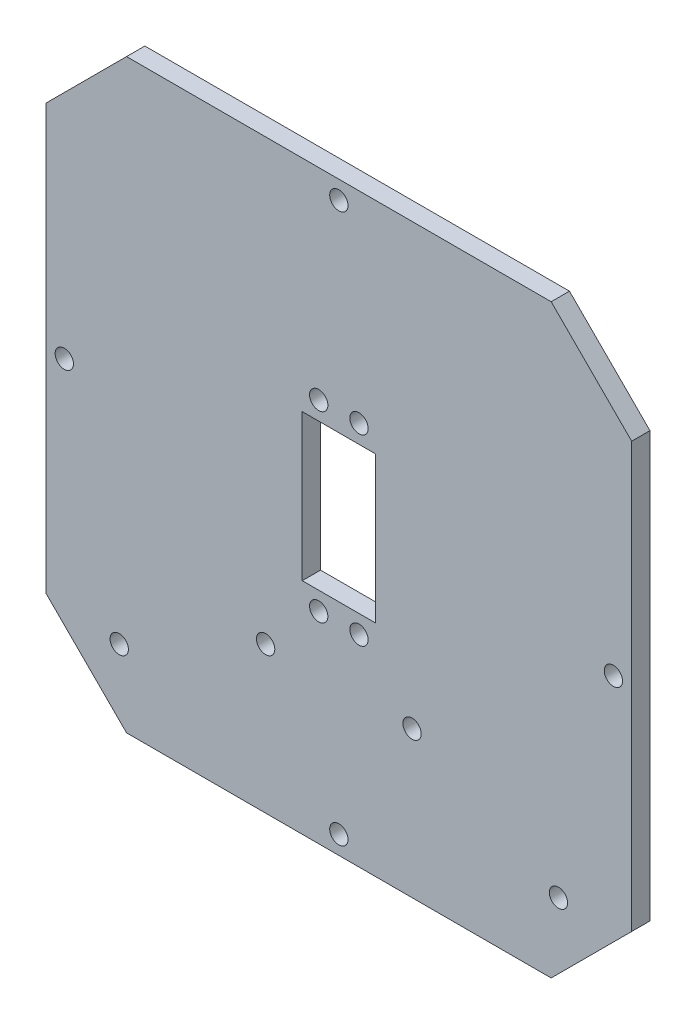
ISO-10303-21;
HEADER;
FILE_DESCRIPTION(('STEP AP214'),'2;1');
FILE_NAME('part.step','',(''),(''),'','','');
FILE_SCHEMA(('AUTOMOTIVE_DESIGN { 1 0 10303 214 1 1 1 1 }'));
ENDSEC;
DATA;
#1=APPLICATION_CONTEXT('core data for automotive mechanical design processes');
#2=APPLICATION_PROTOCOL_DEFINITION('international standard','automotive_design',2000,#1);
#3=PRODUCT_CONTEXT('',#1,'mechanical');
#4=PRODUCT('Part','Part','',(#3));
#5=PRODUCT_RELATED_PRODUCT_CATEGORY('part','',(#4));
#6=PRODUCT_DEFINITION_FORMATION('','',#4);
#7=PRODUCT_DEFINITION_CONTEXT('part definition',#1,'design');
#8=PRODUCT_DEFINITION('design','',#6,#7);
#9=PRODUCT_DEFINITION_SHAPE('','',#8);
#10=(LENGTH_UNIT() NAMED_UNIT(*) SI_UNIT(.MILLI.,.METRE.));
#11=(NAMED_UNIT(*) PLANE_ANGLE_UNIT() SI_UNIT($,.RADIAN.));
#12=(NAMED_UNIT(*) SI_UNIT($,.STERADIAN.) SOLID_ANGLE_UNIT());
#13=UNCERTAINTY_MEASURE_WITH_UNIT(LENGTH_MEASURE(1.E-05),#10,'distance_accuracy_value','');
#14=(GEOMETRIC_REPRESENTATION_CONTEXT(3) GLOBAL_UNCERTAINTY_ASSIGNED_CONTEXT((#13)) GLOBAL_UNIT_ASSIGNED_CONTEXT((#10,
#11,#12)) REPRESENTATION_CONTEXT('',''));
#15=CARTESIAN_POINT('',(0.,0.,0.));
#16=DIRECTION('',(0.,0.,1.));
#17=DIRECTION('',(1.,0.,0.));
#18=AXIS2_PLACEMENT_3D('',#15,#16,#17);
#19=CARTESIAN_POINT('',(-28.3501175972928,34.1567681895093,5.));
#20=DIRECTION('',(1.,0.,0.));
#21=DIRECTION('',(0.,1.,0.));
#22=AXIS2_PLACEMENT_3D('',#19,#20,#21);
#23=PLANE('',#22);
#24=DIRECTION('',(0.,-1.,0.));
#25=VECTOR('',#24,1.);
#26=CARTESIAN_POINT('',(-28.3501175972928,34.1567681895093,0.));
#27=LINE('',#26,#25);
#28=CARTESIAN_POINT('',(-28.3501175972927,12.1567681895093,0.));
#29=VERTEX_POINT('',#28);
#30=CARTESIAN_POINT('',(-28.3501175972927,-103.843231810491,0.));
#31=VERTEX_POINT('',#30);
#32=EDGE_CURVE('E161',#29,#31,#27,.T.);
#33=ORIENTED_EDGE('',*,*,#32,.T.);
#34=DIRECTION('',(0.,0.,1.));
#35=VECTOR('',#34,1.);
#36=CARTESIAN_POINT('',(-28.3501175972927,-103.843231810491,5.));
#37=LINE('',#36,#35);
#38=CARTESIAN_POINT('',(-28.3501175972927,-103.843231810491,5.));
#39=VERTEX_POINT('',#38);
#40=EDGE_CURVE('E204',#31,#39,#37,.T.);
#41=ORIENTED_EDGE('',*,*,#40,.T.);
#42=DIRECTION('',(0.,-1.,0.));
#43=VECTOR('',#42,1.);
#44=CARTESIAN_POINT('',(-28.3501175972928,34.1567681895093,5.));
#45=LINE('',#44,#43);
#46=CARTESIAN_POINT('',(-28.3501175972927,12.1567681895093,5.));
#47=VERTEX_POINT('',#46);
#48=EDGE_CURVE('E165',#47,#39,#45,.T.);
#49=ORIENTED_EDGE('',*,*,#48,.F.);
#50=DIRECTION('',(0.,0.,-1.));
#51=VECTOR('',#50,1.);
#52=CARTESIAN_POINT('',(-28.3501175972927,12.1567681895093,5.));
#53=LINE('',#52,#51);
#54=EDGE_CURVE('E201',#47,#29,#53,.T.);
#55=ORIENTED_EDGE('',*,*,#54,.T.);
#56=EDGE_LOOP('',(#33,#41,#49,#55));
#57=FACE_BOUND('',#56,.T.);
#58=ADVANCED_FACE('F33',(#57),#23,.F.);
#59=CARTESIAN_POINT('',(-28.3501175972927,-125.843231810491,5.));
#60=DIRECTION('',(0.,1.,0.));
#61=DIRECTION('',(0.,0.,1.));
#62=AXIS2_PLACEMENT_3D('',#59,#60,#61);
#63=PLANE('',#62);
#64=DIRECTION('',(1.,0.,0.));
#65=VECTOR('',#64,1.);
#66=CARTESIAN_POINT('',(-28.3501175972927,-125.843231810491,5.));
#67=LINE('',#66,#65);
#68=CARTESIAN_POINT('',(-6.35011759729272,-125.843231810491,5.));
#69=VERTEX_POINT('',#68);
#70=CARTESIAN_POINT('',(109.649882402707,-125.843231810491,5.));
#71=VERTEX_POINT('',#70);
#72=EDGE_CURVE('E168',#69,#71,#67,.T.);
#73=ORIENTED_EDGE('',*,*,#72,.F.);
#74=DIRECTION('',(0.,0.,-1.));
#75=VECTOR('',#74,1.);
#76=CARTESIAN_POINT('',(-6.35011759729274,-125.843231810491,5.));
#77=LINE('',#76,#75);
#78=CARTESIAN_POINT('',(-6.35011759729274,-125.843231810491,0.));
#79=VERTEX_POINT('',#78);
#80=EDGE_CURVE('E190',#69,#79,#77,.T.);
#81=ORIENTED_EDGE('',*,*,#80,.T.);
#82=DIRECTION('',(1.,0.,0.));
#83=VECTOR('',#82,1.);
#84=CARTESIAN_POINT('',(-28.3501175972927,-125.843231810491,0.));
#85=LINE('',#84,#83);
#86=CARTESIAN_POINT('',(109.649882402707,-125.843231810491,0.));
#87=VERTEX_POINT('',#86);
#88=EDGE_CURVE('E181',#79,#87,#85,.T.);
#89=ORIENTED_EDGE('',*,*,#88,.T.);
#90=DIRECTION('',(0.,0.,1.));
#91=VECTOR('',#90,1.);
#92=CARTESIAN_POINT('',(109.649882402707,-125.843231810491,5.));
#93=LINE('',#92,#91);
#94=EDGE_CURVE('E178',#87,#71,#93,.T.);
#95=ORIENTED_EDGE('',*,*,#94,.T.);
#96=EDGE_LOOP('',(#73,#81,#89,#95));
#97=FACE_BOUND('',#96,.T.);
#98=ADVANCED_FACE('F302',(#97),#63,.F.);
#99=CARTESIAN_POINT('',(131.649882402707,34.1567681895093,5.));
#100=DIRECTION('',(-1.,0.,0.));
#101=DIRECTION('',(0.,-1.,0.));
#102=AXIS2_PLACEMENT_3D('',#99,#100,#101);
#103=PLANE('',#102);
#104=DIRECTION('',(0.,1.,0.));
#105=VECTOR('',#104,1.);
#106=CARTESIAN_POINT('',(131.649882402707,34.1567681895093,5.));
#107=LINE('',#106,#105);
#108=CARTESIAN_POINT('',(131.649882402707,-103.843231810491,5.));
#109=VERTEX_POINT('',#108);
#110=CARTESIAN_POINT('',(131.649882402707,12.1567681895092,5.));
#111=VERTEX_POINT('',#110);
#112=EDGE_CURVE('E172',#109,#111,#107,.T.);
#113=ORIENTED_EDGE('',*,*,#112,.F.);
#114=DIRECTION('',(0.,0.,-1.));
#115=VECTOR('',#114,1.);
#116=CARTESIAN_POINT('',(131.649882402707,-103.843231810491,5.));
#117=LINE('',#116,#115);
#118=CARTESIAN_POINT('',(131.649882402707,-103.843231810491,0.));
#119=VERTEX_POINT('',#118);
#120=EDGE_CURVE('E216',#109,#119,#117,.T.);
#121=ORIENTED_EDGE('',*,*,#120,.T.);
#122=DIRECTION('',(0.,1.,0.));
#123=VECTOR('',#122,1.);
#124=CARTESIAN_POINT('',(131.649882402707,34.1567681895093,0.));
#125=LINE('',#124,#123);
#126=CARTESIAN_POINT('',(131.649882402707,12.1567681895092,0.));
#127=VERTEX_POINT('',#126);
#128=EDGE_CURVE('E184',#119,#127,#125,.T.);
#129=ORIENTED_EDGE('',*,*,#128,.T.);
#130=DIRECTION('',(0.,0.,1.));
#131=VECTOR('',#130,1.);
#132=CARTESIAN_POINT('',(131.649882402707,12.1567681895092,5.));
#133=LINE('',#132,#131);
#134=EDGE_CURVE('E214',#127,#111,#133,.T.);
#135=ORIENTED_EDGE('',*,*,#134,.T.);
#136=EDGE_LOOP('',(#113,#121,#129,#135));
#137=FACE_BOUND('',#136,.T.);
#138=ADVANCED_FACE('F312',(#137),#103,.F.);
#139=CARTESIAN_POINT('',(-28.3501175972928,34.1567681895093,5.));
#140=DIRECTION('',(0.,-1.,0.));
#141=DIRECTION('',(0.,0.,-1.));
#142=AXIS2_PLACEMENT_3D('',#139,#140,#141);
#143=PLANE('',#142);
#144=DIRECTION('',(-1.,0.,0.));
#145=VECTOR('',#144,1.);
#146=CARTESIAN_POINT('',(-28.3501175972928,34.1567681895093,5.));
#147=LINE('',#146,#145);
#148=CARTESIAN_POINT('',(109.649882402707,34.1567681895093,5.));
#149=VERTEX_POINT('',#148);
#150=CARTESIAN_POINT('',(-6.35011759729264,34.1567681895093,5.));
#151=VERTEX_POINT('',#150);
#152=EDGE_CURVE('E175',#149,#151,#147,.T.);
#153=ORIENTED_EDGE('',*,*,#152,.F.);
#154=DIRECTION('',(0.,0.,-1.));
#155=VECTOR('',#154,1.);
#156=CARTESIAN_POINT('',(109.649882402707,34.1567681895093,5.));
#157=LINE('',#156,#155);
#158=CARTESIAN_POINT('',(109.649882402707,34.1567681895093,0.));
#159=VERTEX_POINT('',#158);
#160=EDGE_CURVE('E11',#149,#159,#157,.T.);
#161=ORIENTED_EDGE('',*,*,#160,.T.);
#162=DIRECTION('',(-1.,0.,0.));
#163=VECTOR('',#162,1.);
#164=CARTESIAN_POINT('',(-28.3501175972928,34.1567681895093,0.));
#165=LINE('',#164,#163);
#166=CARTESIAN_POINT('',(-6.35011759729264,34.1567681895093,0.));
#167=VERTEX_POINT('',#166);
#168=EDGE_CURVE('E169',#159,#167,#165,.T.);
#169=ORIENTED_EDGE('',*,*,#168,.T.);
#170=DIRECTION('',(0.,0.,1.));
#171=VECTOR('',#170,1.);
#172=CARTESIAN_POINT('',(-6.35011759729264,34.1567681895093,5.));
#173=LINE('',#172,#171);
#174=EDGE_CURVE('E42',#167,#151,#173,.T.);
#175=ORIENTED_EDGE('',*,*,#174,.T.);
#176=EDGE_LOOP('',(#153,#161,#169,#175));
#177=FACE_BOUND('',#176,.T.);
#178=ADVANCED_FACE('F285',(#177),#143,.F.);
#179=CARTESIAN_POINT('',(0.,0.,5.));
#180=DIRECTION('',(0.,0.,1.));
#181=DIRECTION('',(1.,0.,0.));
#182=AXIS2_PLACEMENT_3D('',#179,#180,#181);
#183=PLANE('',#182);
#184=CARTESIAN_POINT('',(31.6498824027073,-85.8432318104907,5.));
#185=DIRECTION('',(0.,0.,1.));
#186=DIRECTION('',(1.,0.,0.));
#187=AXIS2_PLACEMENT_3D('',#184,#185,#186);
#188=CIRCLE('',#187,2.5);
#189=CARTESIAN_POINT('',(34.1498824027073,-85.8432318104907,5.));
#190=VERTEX_POINT('',#189);
#191=EDGE_CURVE('E538',#190,#190,#188,.T.);
#192=ORIENTED_EDGE('',*,*,#191,.F.);
#193=EDGE_LOOP('',(#192));
#194=FACE_BOUND('',#193,.T.);
#195=CARTESIAN_POINT('',(71.6498824027073,-85.8432318104907,5.));
#196=DIRECTION('',(0.,0.,1.));
#197=DIRECTION('',(1.,0.,0.));
#198=AXIS2_PLACEMENT_3D('',#195,#196,#197);
#199=CIRCLE('',#198,2.5);
#200=CARTESIAN_POINT('',(74.1498824027073,-85.8432318104907,5.));
#201=VERTEX_POINT('',#200);
#202=EDGE_CURVE('E547',#201,#201,#199,.T.);
#203=ORIENTED_EDGE('',*,*,#202,.F.);
#204=EDGE_LOOP('',(#203));
#205=FACE_BOUND('',#204,.T.);
#206=CARTESIAN_POINT('',(-8.35011759729274,-105.843231810491,5.));
#207=DIRECTION('',(0.,0.,1.));
#208=DIRECTION('',(1.,0.,0.));
#209=AXIS2_PLACEMENT_3D('',#206,#207,#208);
#210=CIRCLE('',#209,2.5);
#211=CARTESIAN_POINT('',(-5.85011759729274,-105.843231810491,5.));
#212=VERTEX_POINT('',#211);
#213=EDGE_CURVE('E248',#212,#212,#210,.T.);
#214=ORIENTED_EDGE('',*,*,#213,.F.);
#215=EDGE_LOOP('',(#214));
#216=FACE_BOUND('',#215,.T.);
#217=CARTESIAN_POINT('',(111.649882402707,-105.843231810491,5.));
#218=DIRECTION('',(0.,0.,1.));
#219=DIRECTION('',(1.,0.,0.));
#220=AXIS2_PLACEMENT_3D('',#217,#218,#219);
#221=CIRCLE('',#220,2.50000000000001);
#222=CARTESIAN_POINT('',(114.149882402707,-105.843231810491,5.));
#223=VERTEX_POINT('',#222);
#224=EDGE_CURVE('E238',#223,#223,#221,.T.);
#225=ORIENTED_EDGE('',*,*,#224,.F.);
#226=EDGE_LOOP('',(#225));
#227=FACE_BOUND('',#226,.T.);
#228=CARTESIAN_POINT('',(126.649882402707,-45.8432318104907,5.));
#229=DIRECTION('',(0.,0.,1.));
#230=DIRECTION('',(1.,0.,0.));
#231=AXIS2_PLACEMENT_3D('',#228,#229,#230);
#232=CIRCLE('',#231,2.5);
#233=CARTESIAN_POINT('',(129.149882402707,-45.8432318104907,5.));
#234=VERTEX_POINT('',#233);
#235=EDGE_CURVE('E235',#234,#234,#232,.T.);
#236=ORIENTED_EDGE('',*,*,#235,.F.);
#237=EDGE_LOOP('',(#236));
#238=FACE_BOUND('',#237,.T.);
#239=CARTESIAN_POINT('',(51.6498824027073,-120.843231810491,5.));
#240=DIRECTION('',(0.,0.,1.));
#241=DIRECTION('',(1.,0.,0.));
#242=AXIS2_PLACEMENT_3D('',#239,#240,#241);
#243=CIRCLE('',#242,2.5);
#244=CARTESIAN_POINT('',(54.1498824027073,-120.843231810491,5.));
#245=VERTEX_POINT('',#244);
#246=EDGE_CURVE('E232',#245,#245,#243,.T.);
#247=ORIENTED_EDGE('',*,*,#246,.F.);
#248=EDGE_LOOP('',(#247));
#249=FACE_BOUND('',#248,.T.);
#250=CARTESIAN_POINT('',(-23.3501175972927,-45.8432318104907,5.));
#251=DIRECTION('',(0.,0.,1.));
#252=DIRECTION('',(1.,0.,0.));
#253=AXIS2_PLACEMENT_3D('',#250,#251,#252);
#254=CIRCLE('',#253,2.5);
#255=CARTESIAN_POINT('',(-20.8501175972927,-45.8432318104907,5.));
#256=VERTEX_POINT('',#255);
#257=EDGE_CURVE('E228',#256,#256,#254,.T.);
#258=ORIENTED_EDGE('',*,*,#257,.F.);
#259=EDGE_LOOP('',(#258));
#260=FACE_BOUND('',#259,.T.);
#261=CARTESIAN_POINT('',(51.6498824027073,29.1567681895093,5.));
#262=DIRECTION('',(0.,0.,1.));
#263=DIRECTION('',(1.,0.,0.));
#264=AXIS2_PLACEMENT_3D('',#261,#262,#263);
#265=CIRCLE('',#264,2.5);
#266=CARTESIAN_POINT('',(54.1498824027073,29.1567681895093,5.));
#267=VERTEX_POINT('',#266);
#268=EDGE_CURVE('E224',#267,#267,#265,.T.);
#269=ORIENTED_EDGE('',*,*,#268,.F.);
#270=EDGE_LOOP('',(#269));
#271=FACE_BOUND('',#270,.T.);
#272=CARTESIAN_POINT('',(57.1498824027073,-70.8432318104907,5.));
#273=DIRECTION('',(0.,0.,1.));
#274=DIRECTION('',(1.,0.,0.));
#275=AXIS2_PLACEMENT_3D('',#272,#273,#274);
#276=CIRCLE('',#275,2.5);
#277=CARTESIAN_POINT('',(59.6498824027073,-70.8432318104907,5.));
#278=VERTEX_POINT('',#277);
#279=EDGE_CURVE('E260',#278,#278,#276,.T.);
#280=ORIENTED_EDGE('',*,*,#279,.F.);
#281=EDGE_LOOP('',(#280));
#282=FACE_BOUND('',#281,.T.);
#283=CARTESIAN_POINT('',(46.1498824027073,-70.8432318104907,5.));
#284=DIRECTION('',(0.,0.,1.));
#285=DIRECTION('',(1.,0.,0.));
#286=AXIS2_PLACEMENT_3D('',#283,#284,#285);
#287=CIRCLE('',#286,2.5);
#288=CARTESIAN_POINT('',(48.6498824027073,-70.8432318104907,5.));
#289=VERTEX_POINT('',#288);
#290=EDGE_CURVE('E263',#289,#289,#287,.T.);
#291=ORIENTED_EDGE('',*,*,#290,.F.);
#292=EDGE_LOOP('',(#291));
#293=FACE_BOUND('',#292,.T.);
#294=CARTESIAN_POINT('',(57.1498824027073,-20.8432318104907,5.));
#295=DIRECTION('',(0.,0.,1.));
#296=DIRECTION('',(1.,0.,0.));
#297=AXIS2_PLACEMENT_3D('',#294,#295,#296);
#298=CIRCLE('',#297,2.49999999999999);
#299=CARTESIAN_POINT('',(59.6498824027073,-20.8432318104907,5.));
#300=VERTEX_POINT('',#299);
#301=EDGE_CURVE('E267',#300,#300,#298,.T.);
#302=ORIENTED_EDGE('',*,*,#301,.F.);
#303=EDGE_LOOP('',(#302));
#304=FACE_BOUND('',#303,.T.);
#305=CARTESIAN_POINT('',(46.1498824027073,-20.8432318104907,5.));
#306=DIRECTION('',(0.,0.,1.));
#307=DIRECTION('',(1.,0.,0.));
#308=AXIS2_PLACEMENT_3D('',#305,#306,#307);
#309=CIRCLE('',#308,2.5);
#310=CARTESIAN_POINT('',(48.6498824027073,-20.8432318104907,5.));
#311=VERTEX_POINT('',#310);
#312=EDGE_CURVE('E148',#311,#311,#309,.T.);
#313=ORIENTED_EDGE('',*,*,#312,.F.);
#314=EDGE_LOOP('',(#313));
#315=FACE_BOUND('',#314,.T.);
#316=DIRECTION('',(0.,-1.,0.));
#317=VECTOR('',#316,1.);
#318=CARTESIAN_POINT('',(41.6498824027073,-25.8432318104907,5.));
#319=LINE('',#318,#317);
#320=CARTESIAN_POINT('',(41.6498824027073,-25.8432318104907,5.));
#321=VERTEX_POINT('',#320);
#322=CARTESIAN_POINT('',(41.6498824027073,-65.8432318104907,5.));
#323=VERTEX_POINT('',#322);
#324=EDGE_CURVE('E50',#321,#323,#319,.T.);
#325=ORIENTED_EDGE('',*,*,#324,.F.);
#326=DIRECTION('',(-1.,0.,0.));
#327=VECTOR('',#326,1.);
#328=CARTESIAN_POINT('',(41.6498824027073,-25.8432318104907,5.));
#329=LINE('',#328,#327);
#330=CARTESIAN_POINT('',(61.6498824027073,-25.8432318104907,5.));
#331=VERTEX_POINT('',#330);
#332=EDGE_CURVE('E142',#331,#321,#329,.T.);
#333=ORIENTED_EDGE('',*,*,#332,.F.);
#334=DIRECTION('',(0.,1.,0.));
#335=VECTOR('',#334,1.);
#336=CARTESIAN_POINT('',(61.6498824027073,-25.8432318104907,5.));
#337=LINE('',#336,#335);
#338=CARTESIAN_POINT('',(61.6498824027073,-65.8432318104907,5.));
#339=VERTEX_POINT('',#338);
#340=EDGE_CURVE('E145',#339,#331,#337,.T.);
#341=ORIENTED_EDGE('',*,*,#340,.F.);
#342=DIRECTION('',(1.,0.,0.));
#343=VECTOR('',#342,1.);
#344=CARTESIAN_POINT('',(41.6498824027073,-65.8432318104907,5.));
#345=LINE('',#344,#343);
#346=EDGE_CURVE('E154',#323,#339,#345,.T.);
#347=ORIENTED_EDGE('',*,*,#346,.F.);
#348=EDGE_LOOP('',(#325,#333,#341,#347));
#349=FACE_BOUND('',#348,.T.);
#350=ORIENTED_EDGE('',*,*,#48,.T.);
#351=DIRECTION('',(-0.707106781186546,0.707106781186549,0.));
#352=VECTOR('',#351,1.);
#353=CARTESIAN_POINT('',(-66.0966747038917,-66.0966747038914,5.));
#354=LINE('',#353,#352);
#355=EDGE_CURVE('E212',#39,#69,#354,.F.);
#356=ORIENTED_EDGE('',*,*,#355,.T.);
#357=ORIENTED_EDGE('',*,*,#72,.T.);
#358=DIRECTION('',(-0.707106781186549,-0.707106781186546,0.));
#359=VECTOR('',#358,1.);
#360=CARTESIAN_POINT('',(117.746557106599,-117.746557106599,5.));
#361=LINE('',#360,#359);
#362=EDGE_CURVE('E210',#71,#109,#361,.F.);
#363=ORIENTED_EDGE('',*,*,#362,.T.);
#364=ORIENTED_EDGE('',*,*,#112,.T.);
#365=DIRECTION('',(0.707106781186547,-0.707106781186548,0.));
#366=VECTOR('',#365,1.);
#367=CARTESIAN_POINT('',(71.9033252961084,71.9033252961082,5.));
#368=LINE('',#367,#366);
#369=EDGE_CURVE('E208',#111,#149,#368,.F.);
#370=ORIENTED_EDGE('',*,*,#369,.T.);
#371=ORIENTED_EDGE('',*,*,#152,.T.);
#372=DIRECTION('',(0.707106781186549,0.707106781186546,0.));
#373=VECTOR('',#372,1.);
#374=CARTESIAN_POINT('',(-20.253442893401,20.253442893401,5.));
#375=LINE('',#374,#373);
#376=EDGE_CURVE('E206',#151,#47,#375,.F.);
#377=ORIENTED_EDGE('',*,*,#376,.T.);
#378=EDGE_LOOP('',(#350,#356,#357,#363,#364,#370,#371,#377));
#379=FACE_BOUND('',#378,.T.);
#380=ADVANCED_FACE('F282',(#194,#205,#216,#227,#238,#249,#260,#271,#282,#293,#304,#315,#349,
#379),#183,.T.);
#381=CARTESIAN_POINT('',(0.,0.,0.));
#382=DIRECTION('',(0.,0.,1.));
#383=DIRECTION('',(1.,0.,0.));
#384=AXIS2_PLACEMENT_3D('',#381,#382,#383);
#385=PLANE('',#384);
#386=CARTESIAN_POINT('',(31.6498824027073,-85.8432318104907,0.));
#387=DIRECTION('',(0.,0.,-1.));
#388=DIRECTION('',(-1.,0.,0.));
#389=AXIS2_PLACEMENT_3D('',#386,#387,#388);
#390=CIRCLE('',#389,2.5);
#391=CARTESIAN_POINT('',(29.1498824027073,-85.8432318104907,0.));
#392=VERTEX_POINT('',#391);
#393=EDGE_CURVE('E541',#392,#392,#390,.T.);
#394=ORIENTED_EDGE('',*,*,#393,.F.);
#395=EDGE_LOOP('',(#394));
#396=FACE_BOUND('',#395,.T.);
#397=CARTESIAN_POINT('',(71.6498824027073,-85.8432318104907,0.));
#398=DIRECTION('',(0.,0.,-1.));
#399=DIRECTION('',(-1.,0.,0.));
#400=AXIS2_PLACEMENT_3D('',#397,#398,#399);
#401=CIRCLE('',#400,2.5);
#402=CARTESIAN_POINT('',(69.1498824027073,-85.8432318104907,0.));
#403=VERTEX_POINT('',#402);
#404=EDGE_CURVE('E543',#403,#403,#401,.T.);
#405=ORIENTED_EDGE('',*,*,#404,.F.);
#406=EDGE_LOOP('',(#405));
#407=FACE_BOUND('',#406,.T.);
#408=CARTESIAN_POINT('',(-8.35011759729274,-105.843231810491,0.));
#409=DIRECTION('',(0.,0.,1.));
#410=DIRECTION('',(1.,0.,0.));
#411=AXIS2_PLACEMENT_3D('',#408,#409,#410);
#412=CIRCLE('',#411,2.5);
#413=CARTESIAN_POINT('',(-5.85011759729274,-105.843231810491,0.));
#414=VERTEX_POINT('',#413);
#415=EDGE_CURVE('E37',#414,#414,#412,.T.);
#416=ORIENTED_EDGE('',*,*,#415,.T.);
#417=EDGE_LOOP('',(#416));
#418=FACE_BOUND('',#417,.T.);
#419=CARTESIAN_POINT('',(111.649882402707,-105.843231810491,0.));
#420=DIRECTION('',(0.,0.,1.));
#421=DIRECTION('',(1.,0.,0.));
#422=AXIS2_PLACEMENT_3D('',#419,#420,#421);
#423=CIRCLE('',#422,2.50000000000001);
#424=CARTESIAN_POINT('',(114.149882402707,-105.843231810491,0.));
#425=VERTEX_POINT('',#424);
#426=EDGE_CURVE('E236',#425,#425,#423,.T.);
#427=ORIENTED_EDGE('',*,*,#426,.T.);
#428=EDGE_LOOP('',(#427));
#429=FACE_BOUND('',#428,.T.);
#430=CARTESIAN_POINT('',(126.649882402707,-45.8432318104907,0.));
#431=DIRECTION('',(0.,0.,1.));
#432=DIRECTION('',(1.,0.,0.));
#433=AXIS2_PLACEMENT_3D('',#430,#431,#432);
#434=CIRCLE('',#433,2.5);
#435=CARTESIAN_POINT('',(129.149882402707,-45.8432318104907,0.));
#436=VERTEX_POINT('',#435);
#437=EDGE_CURVE('E233',#436,#436,#434,.T.);
#438=ORIENTED_EDGE('',*,*,#437,.T.);
#439=EDGE_LOOP('',(#438));
#440=FACE_BOUND('',#439,.T.);
#441=CARTESIAN_POINT('',(51.6498824027073,-120.843231810491,0.));
#442=DIRECTION('',(0.,0.,1.));
#443=DIRECTION('',(1.,0.,0.));
#444=AXIS2_PLACEMENT_3D('',#441,#442,#443);
#445=CIRCLE('',#444,2.5);
#446=CARTESIAN_POINT('',(54.1498824027073,-120.843231810491,0.));
#447=VERTEX_POINT('',#446);
#448=EDGE_CURVE('E229',#447,#447,#445,.T.);
#449=ORIENTED_EDGE('',*,*,#448,.T.);
#450=EDGE_LOOP('',(#449));
#451=FACE_BOUND('',#450,.T.);
#452=CARTESIAN_POINT('',(-23.3501175972927,-45.8432318104907,0.));
#453=DIRECTION('',(0.,0.,1.));
#454=DIRECTION('',(1.,0.,0.));
#455=AXIS2_PLACEMENT_3D('',#452,#453,#454);
#456=CIRCLE('',#455,2.5);
#457=CARTESIAN_POINT('',(-20.8501175972927,-45.8432318104907,0.));
#458=VERTEX_POINT('',#457);
#459=EDGE_CURVE('E225',#458,#458,#456,.T.);
#460=ORIENTED_EDGE('',*,*,#459,.T.);
#461=EDGE_LOOP('',(#460));
#462=FACE_BOUND('',#461,.T.);
#463=CARTESIAN_POINT('',(51.6498824027073,29.1567681895093,0.));
#464=DIRECTION('',(0.,0.,1.));
#465=DIRECTION('',(1.,0.,0.));
#466=AXIS2_PLACEMENT_3D('',#463,#464,#465);
#467=CIRCLE('',#466,2.5);
#468=CARTESIAN_POINT('',(54.1498824027073,29.1567681895093,0.));
#469=VERTEX_POINT('',#468);
#470=EDGE_CURVE('E220',#469,#469,#467,.T.);
#471=ORIENTED_EDGE('',*,*,#470,.T.);
#472=EDGE_LOOP('',(#471));
#473=FACE_BOUND('',#472,.T.);
#474=CARTESIAN_POINT('',(57.1498824027073,-70.8432318104907,0.));
#475=DIRECTION('',(0.,0.,-1.));
#476=DIRECTION('',(-1.,0.,0.));
#477=AXIS2_PLACEMENT_3D('',#474,#475,#476);
#478=CIRCLE('',#477,2.5);
#479=CARTESIAN_POINT('',(54.6498824027073,-70.8432318104907,0.));
#480=VERTEX_POINT('',#479);
#481=EDGE_CURVE('E223',#480,#480,#478,.T.);
#482=ORIENTED_EDGE('',*,*,#481,.F.);
#483=EDGE_LOOP('',(#482));
#484=FACE_BOUND('',#483,.T.);
#485=CARTESIAN_POINT('',(46.1498824027073,-70.8432318104907,0.));
#486=DIRECTION('',(0.,0.,1.));
#487=DIRECTION('',(1.,0.,0.));
#488=AXIS2_PLACEMENT_3D('',#485,#486,#487);
#489=CIRCLE('',#488,2.5);
#490=CARTESIAN_POINT('',(48.6498824027073,-70.8432318104907,0.));
#491=VERTEX_POINT('',#490);
#492=EDGE_CURVE('E264',#491,#491,#489,.T.);
#493=ORIENTED_EDGE('',*,*,#492,.T.);
#494=EDGE_LOOP('',(#493));
#495=FACE_BOUND('',#494,.T.);
#496=CARTESIAN_POINT('',(57.1498824027073,-20.8432318104907,0.));
#497=DIRECTION('',(0.,0.,1.));
#498=DIRECTION('',(1.,0.,0.));
#499=AXIS2_PLACEMENT_3D('',#496,#497,#498);
#500=CIRCLE('',#499,2.49999999999999);
#501=CARTESIAN_POINT('',(59.6498824027073,-20.8432318104907,0.));
#502=VERTEX_POINT('',#501);
#503=EDGE_CURVE('E270',#502,#502,#500,.T.);
#504=ORIENTED_EDGE('',*,*,#503,.T.);
#505=EDGE_LOOP('',(#504));
#506=FACE_BOUND('',#505,.T.);
#507=CARTESIAN_POINT('',(46.1498824027073,-20.8432318104907,0.));
#508=DIRECTION('',(0.,0.,1.));
#509=DIRECTION('',(1.,0.,0.));
#510=AXIS2_PLACEMENT_3D('',#507,#508,#509);
#511=CIRCLE('',#510,2.5);
#512=CARTESIAN_POINT('',(48.6498824027073,-20.8432318104907,0.));
#513=VERTEX_POINT('',#512);
#514=EDGE_CURVE('E155',#513,#513,#511,.T.);
#515=ORIENTED_EDGE('',*,*,#514,.T.);
#516=EDGE_LOOP('',(#515));
#517=FACE_BOUND('',#516,.T.);
#518=DIRECTION('',(-1.,0.,0.));
#519=VECTOR('',#518,1.);
#520=CARTESIAN_POINT('',(41.6498824027073,-25.8432318104907,0.));
#521=LINE('',#520,#519);
#522=CARTESIAN_POINT('',(61.6498824027073,-25.8432318104907,0.));
#523=VERTEX_POINT('',#522);
#524=CARTESIAN_POINT('',(41.6498824027073,-25.8432318104907,0.));
#525=VERTEX_POINT('',#524);
#526=EDGE_CURVE('E132',#523,#525,#521,.T.);
#527=ORIENTED_EDGE('',*,*,#526,.T.);
#528=DIRECTION('',(0.,-1.,0.));
#529=VECTOR('',#528,1.);
#530=CARTESIAN_POINT('',(41.6498824027073,-25.8432318104907,0.));
#531=LINE('',#530,#529);
#532=CARTESIAN_POINT('',(41.6498824027073,-65.8432318104907,0.));
#533=VERTEX_POINT('',#532);
#534=EDGE_CURVE('E126',#525,#533,#531,.T.);
#535=ORIENTED_EDGE('',*,*,#534,.T.);
#536=DIRECTION('',(1.,0.,0.));
#537=VECTOR('',#536,1.);
#538=CARTESIAN_POINT('',(41.6498824027073,-65.8432318104907,0.));
#539=LINE('',#538,#537);
#540=CARTESIAN_POINT('',(61.6498824027073,-65.8432318104907,0.));
#541=VERTEX_POINT('',#540);
#542=EDGE_CURVE('E135',#533,#541,#539,.T.);
#543=ORIENTED_EDGE('',*,*,#542,.T.);
#544=DIRECTION('',(0.,1.,0.));
#545=VECTOR('',#544,1.);
#546=CARTESIAN_POINT('',(61.6498824027073,-25.8432318104907,0.));
#547=LINE('',#546,#545);
#548=EDGE_CURVE('E58',#541,#523,#547,.T.);
#549=ORIENTED_EDGE('',*,*,#548,.T.);
#550=EDGE_LOOP('',(#527,#535,#543,#549));
#551=FACE_BOUND('',#550,.T.);
#552=ORIENTED_EDGE('',*,*,#88,.F.);
#553=DIRECTION('',(0.707106781186546,-0.707106781186549,0.));
#554=VECTOR('',#553,1.);
#555=CARTESIAN_POINT('',(-6.35011759729274,-125.843231810491,0.));
#556=LINE('',#555,#554);
#557=EDGE_CURVE('E199',#79,#31,#556,.F.);
#558=ORIENTED_EDGE('',*,*,#557,.T.);
#559=ORIENTED_EDGE('',*,*,#32,.F.);
#560=DIRECTION('',(-0.707106781186549,-0.707106781186546,0.));
#561=VECTOR('',#560,1.);
#562=CARTESIAN_POINT('',(-28.3501175972927,12.1567681895093,0.));
#563=LINE('',#562,#561);
#564=EDGE_CURVE('E193',#29,#167,#563,.F.);
#565=ORIENTED_EDGE('',*,*,#564,.T.);
#566=ORIENTED_EDGE('',*,*,#168,.F.);
#567=DIRECTION('',(-0.707106781186547,0.707106781186548,0.));
#568=VECTOR('',#567,1.);
#569=CARTESIAN_POINT('',(109.649882402707,34.1567681895093,0.));
#570=LINE('',#569,#568);
#571=EDGE_CURVE('E195',#159,#127,#570,.F.);
#572=ORIENTED_EDGE('',*,*,#571,.T.);
#573=ORIENTED_EDGE('',*,*,#128,.F.);
#574=DIRECTION('',(0.707106781186549,0.707106781186546,0.));
#575=VECTOR('',#574,1.);
#576=CARTESIAN_POINT('',(131.649882402707,-103.843231810491,0.));
#577=LINE('',#576,#575);
#578=EDGE_CURVE('E197',#119,#87,#577,.F.);
#579=ORIENTED_EDGE('',*,*,#578,.T.);
#580=EDGE_LOOP('',(#552,#558,#559,#565,#566,#572,#573,#579));
#581=FACE_BOUND('',#580,.T.);
#582=ADVANCED_FACE('F139',(#396,#407,#418,#429,#440,#451,#462,#473,#484,#495,#506,#517,#551,
#581),#385,.F.);
#583=CARTESIAN_POINT('',(-6.35011759729274,-125.843231810491,5.));
#584=DIRECTION('',(0.707106781186549,0.707106781186546,0.));
#585=DIRECTION('',(0.,0.,-1.));
#586=AXIS2_PLACEMENT_3D('',#583,#584,#585);
#587=PLANE('',#586);
#588=ORIENTED_EDGE('',*,*,#355,.F.);
#589=ORIENTED_EDGE('',*,*,#40,.F.);
#590=ORIENTED_EDGE('',*,*,#557,.F.);
#591=ORIENTED_EDGE('',*,*,#80,.F.);
#592=EDGE_LOOP('',(#588,#589,#590,#591));
#593=FACE_BOUND('',#592,.T.);
#594=ADVANCED_FACE('F299',(#593),#587,.F.);
#595=CARTESIAN_POINT('',(131.649882402707,-103.843231810491,5.));
#596=DIRECTION('',(-0.707106781186546,0.707106781186549,0.));
#597=DIRECTION('',(0.,0.,-1.));
#598=AXIS2_PLACEMENT_3D('',#595,#596,#597);
#599=PLANE('',#598);
#600=ORIENTED_EDGE('',*,*,#362,.F.);
#601=ORIENTED_EDGE('',*,*,#94,.F.);
#602=ORIENTED_EDGE('',*,*,#578,.F.);
#603=ORIENTED_EDGE('',*,*,#120,.F.);
#604=EDGE_LOOP('',(#600,#601,#602,#603));
#605=FACE_BOUND('',#604,.T.);
#606=ADVANCED_FACE('F309',(#605),#599,.F.);
#607=CARTESIAN_POINT('',(109.649882402707,34.1567681895093,5.));
#608=DIRECTION('',(-0.707106781186548,-0.707106781186547,0.));
#609=DIRECTION('',(0.,0.,-1.));
#610=AXIS2_PLACEMENT_3D('',#607,#608,#609);
#611=PLANE('',#610);
#612=ORIENTED_EDGE('',*,*,#369,.F.);
#613=ORIENTED_EDGE('',*,*,#134,.F.);
#614=ORIENTED_EDGE('',*,*,#571,.F.);
#615=ORIENTED_EDGE('',*,*,#160,.F.);
#616=EDGE_LOOP('',(#612,#613,#614,#615));
#617=FACE_BOUND('',#616,.T.);
#618=ADVANCED_FACE('F318',(#617),#611,.F.);
#619=CARTESIAN_POINT('',(-28.3501175972927,12.1567681895093,5.));
#620=DIRECTION('',(0.707106781186546,-0.707106781186549,0.));
#621=DIRECTION('',(0.,0.,-1.));
#622=AXIS2_PLACEMENT_3D('',#619,#620,#621);
#623=PLANE('',#622);
#624=ORIENTED_EDGE('',*,*,#376,.F.);
#625=ORIENTED_EDGE('',*,*,#174,.F.);
#626=ORIENTED_EDGE('',*,*,#564,.F.);
#627=ORIENTED_EDGE('',*,*,#54,.F.);
#628=EDGE_LOOP('',(#624,#625,#626,#627));
#629=FACE_BOUND('',#628,.T.);
#630=ADVANCED_FACE('F35',(#629),#623,.F.);
#631=CARTESIAN_POINT('',(41.6498824027073,-25.8432318104907,0.));
#632=DIRECTION('',(-1.,0.,0.));
#633=DIRECTION('',(0.,-1.,0.));
#634=AXIS2_PLACEMENT_3D('',#631,#632,#633);
#635=PLANE('',#634);
#636=ORIENTED_EDGE('',*,*,#324,.T.);
#637=DIRECTION('',(0.,0.,1.));
#638=VECTOR('',#637,1.);
#639=CARTESIAN_POINT('',(41.6498824027073,-65.8432318104907,0.));
#640=LINE('',#639,#638);
#641=EDGE_CURVE('E122',#533,#323,#640,.T.);
#642=ORIENTED_EDGE('',*,*,#641,.F.);
#643=ORIENTED_EDGE('',*,*,#534,.F.);
#644=DIRECTION('',(0.,0.,1.));
#645=VECTOR('',#644,1.);
#646=CARTESIAN_POINT('',(41.6498824027073,-25.8432318104907,0.));
#647=LINE('',#646,#645);
#648=EDGE_CURVE('E159',#525,#321,#647,.T.);
#649=ORIENTED_EDGE('',*,*,#648,.T.);
#650=EDGE_LOOP('',(#636,#642,#643,#649));
#651=FACE_BOUND('',#650,.T.);
#652=ADVANCED_FACE('F124',(#651),#635,.F.);
#653=CARTESIAN_POINT('',(41.6498824027073,-25.8432318104907,0.));
#654=DIRECTION('',(0.,1.,0.));
#655=DIRECTION('',(-1.,0.,0.));
#656=AXIS2_PLACEMENT_3D('',#653,#654,#655);
#657=PLANE('',#656);
#658=ORIENTED_EDGE('',*,*,#332,.T.);
#659=ORIENTED_EDGE('',*,*,#648,.F.);
#660=ORIENTED_EDGE('',*,*,#526,.F.);
#661=DIRECTION('',(0.,0.,1.));
#662=VECTOR('',#661,1.);
#663=CARTESIAN_POINT('',(61.6498824027073,-25.8432318104907,0.));
#664=LINE('',#663,#662);
#665=EDGE_CURVE('E162',#523,#331,#664,.T.);
#666=ORIENTED_EDGE('',*,*,#665,.T.);
#667=EDGE_LOOP('',(#658,#659,#660,#666));
#668=FACE_BOUND('',#667,.T.);
#669=ADVANCED_FACE('F341',(#668),#657,.F.);
#670=CARTESIAN_POINT('',(61.6498824027073,-25.8432318104907,0.));
#671=DIRECTION('',(1.,0.,0.));
#672=DIRECTION('',(0.,0.,-1.));
#673=AXIS2_PLACEMENT_3D('',#670,#671,#672);
#674=PLANE('',#673);
#675=ORIENTED_EDGE('',*,*,#340,.T.);
#676=ORIENTED_EDGE('',*,*,#665,.F.);
#677=ORIENTED_EDGE('',*,*,#548,.F.);
#678=DIRECTION('',(0.,0.,1.));
#679=VECTOR('',#678,1.);
#680=CARTESIAN_POINT('',(61.6498824027073,-65.8432318104907,0.));
#681=LINE('',#680,#679);
#682=EDGE_CURVE('E131',#541,#339,#681,.T.);
#683=ORIENTED_EDGE('',*,*,#682,.T.);
#684=EDGE_LOOP('',(#675,#676,#677,#683));
#685=FACE_BOUND('',#684,.T.);
#686=ADVANCED_FACE('F346',(#685),#674,.F.);
#687=CARTESIAN_POINT('',(41.6498824027073,-65.8432318104907,0.));
#688=DIRECTION('',(0.,-1.,0.));
#689=DIRECTION('',(0.,0.,-1.));
#690=AXIS2_PLACEMENT_3D('',#687,#688,#689);
#691=PLANE('',#690);
#692=ORIENTED_EDGE('',*,*,#346,.T.);
#693=ORIENTED_EDGE('',*,*,#682,.F.);
#694=ORIENTED_EDGE('',*,*,#542,.F.);
#695=ORIENTED_EDGE('',*,*,#641,.T.);
#696=EDGE_LOOP('',(#692,#693,#694,#695));
#697=FACE_BOUND('',#696,.T.);
#698=ADVANCED_FACE('F136',(#697),#691,.F.);
#699=CARTESIAN_POINT('',(46.1498824027073,-20.8432318104907,0.));
#700=DIRECTION('',(0.,0.,1.));
#701=DIRECTION('',(1.,0.,0.));
#702=AXIS2_PLACEMENT_3D('',#699,#700,#701);
#703=CYLINDRICAL_SURFACE('',#702,2.5);
#704=ORIENTED_EDGE('',*,*,#514,.F.);
#705=EDGE_LOOP('',(#704));
#706=FACE_BOUND('',#705,.T.);
#707=ORIENTED_EDGE('',*,*,#312,.T.);
#708=EDGE_LOOP('',(#707));
#709=FACE_BOUND('',#708,.T.);
#710=ADVANCED_FACE('F280',(#706,#709),#703,.F.);
#711=CARTESIAN_POINT('',(57.1498824027073,-20.8432318104907,0.));
#712=DIRECTION('',(0.,0.,1.));
#713=DIRECTION('',(1.,0.,0.));
#714=AXIS2_PLACEMENT_3D('',#711,#712,#713);
#715=CYLINDRICAL_SURFACE('',#714,2.49999999999999);
#716=ORIENTED_EDGE('',*,*,#503,.F.);
#717=EDGE_LOOP('',(#716));
#718=FACE_BOUND('',#717,.T.);
#719=ORIENTED_EDGE('',*,*,#301,.T.);
#720=EDGE_LOOP('',(#719));
#721=FACE_BOUND('',#720,.T.);
#722=ADVANCED_FACE('F424',(#718,#721),#715,.F.);
#723=CARTESIAN_POINT('',(46.1498824027073,-70.8432318104907,0.));
#724=DIRECTION('',(0.,0.,1.));
#725=DIRECTION('',(1.,0.,0.));
#726=AXIS2_PLACEMENT_3D('',#723,#724,#725);
#727=CYLINDRICAL_SURFACE('',#726,2.5);
#728=ORIENTED_EDGE('',*,*,#492,.F.);
#729=EDGE_LOOP('',(#728));
#730=FACE_BOUND('',#729,.T.);
#731=ORIENTED_EDGE('',*,*,#290,.T.);
#732=EDGE_LOOP('',(#731));
#733=FACE_BOUND('',#732,.T.);
#734=ADVANCED_FACE('F434',(#730,#733),#727,.F.);
#735=CARTESIAN_POINT('',(57.1498824027073,-70.8432318104907,10.));
#736=DIRECTION('',(0.,0.,-1.));
#737=DIRECTION('',(-1.,0.,0.));
#738=AXIS2_PLACEMENT_3D('',#735,#736,#737);
#739=CYLINDRICAL_SURFACE('',#738,2.5);
#740=ORIENTED_EDGE('',*,*,#279,.T.);
#741=EDGE_LOOP('',(#740));
#742=FACE_BOUND('',#741,.T.);
#743=ORIENTED_EDGE('',*,*,#481,.T.);
#744=EDGE_LOOP('',(#743));
#745=FACE_BOUND('',#744,.T.);
#746=ADVANCED_FACE('F444',(#742,#745),#739,.F.);
#747=CARTESIAN_POINT('',(51.6498824027073,29.1567681895093,-5.));
#748=DIRECTION('',(0.,0.,1.));
#749=DIRECTION('',(1.,0.,0.));
#750=AXIS2_PLACEMENT_3D('',#747,#748,#749);
#751=CYLINDRICAL_SURFACE('',#750,2.5);
#752=ORIENTED_EDGE('',*,*,#268,.T.);
#753=EDGE_LOOP('',(#752));
#754=FACE_BOUND('',#753,.T.);
#755=ORIENTED_EDGE('',*,*,#470,.F.);
#756=EDGE_LOOP('',(#755));
#757=FACE_BOUND('',#756,.T.);
#758=ADVANCED_FACE('F454',(#754,#757),#751,.F.);
#759=CARTESIAN_POINT('',(-23.3501175972927,-45.8432318104907,-5.));
#760=DIRECTION('',(0.,0.,1.));
#761=DIRECTION('',(1.,0.,0.));
#762=AXIS2_PLACEMENT_3D('',#759,#760,#761);
#763=CYLINDRICAL_SURFACE('',#762,2.5);
#764=ORIENTED_EDGE('',*,*,#257,.T.);
#765=EDGE_LOOP('',(#764));
#766=FACE_BOUND('',#765,.T.);
#767=ORIENTED_EDGE('',*,*,#459,.F.);
#768=EDGE_LOOP('',(#767));
#769=FACE_BOUND('',#768,.T.);
#770=ADVANCED_FACE('F464',(#766,#769),#763,.F.);
#771=CARTESIAN_POINT('',(51.6498824027073,-120.843231810491,-5.));
#772=DIRECTION('',(0.,0.,1.));
#773=DIRECTION('',(1.,0.,0.));
#774=AXIS2_PLACEMENT_3D('',#771,#772,#773);
#775=CYLINDRICAL_SURFACE('',#774,2.5);
#776=ORIENTED_EDGE('',*,*,#246,.T.);
#777=EDGE_LOOP('',(#776));
#778=FACE_BOUND('',#777,.T.);
#779=ORIENTED_EDGE('',*,*,#448,.F.);
#780=EDGE_LOOP('',(#779));
#781=FACE_BOUND('',#780,.T.);
#782=ADVANCED_FACE('F474',(#778,#781),#775,.F.);
#783=CARTESIAN_POINT('',(126.649882402707,-45.8432318104907,-5.));
#784=DIRECTION('',(0.,0.,1.));
#785=DIRECTION('',(1.,0.,0.));
#786=AXIS2_PLACEMENT_3D('',#783,#784,#785);
#787=CYLINDRICAL_SURFACE('',#786,2.5);
#788=ORIENTED_EDGE('',*,*,#235,.T.);
#789=EDGE_LOOP('',(#788));
#790=FACE_BOUND('',#789,.T.);
#791=ORIENTED_EDGE('',*,*,#437,.F.);
#792=EDGE_LOOP('',(#791));
#793=FACE_BOUND('',#792,.T.);
#794=ADVANCED_FACE('F484',(#790,#793),#787,.F.);
#795=CARTESIAN_POINT('',(111.649882402707,-105.843231810491,-25.));
#796=DIRECTION('',(0.,0.,1.));
#797=DIRECTION('',(1.,0.,0.));
#798=AXIS2_PLACEMENT_3D('',#795,#796,#797);
#799=CYLINDRICAL_SURFACE('',#798,2.50000000000001);
#800=ORIENTED_EDGE('',*,*,#224,.T.);
#801=EDGE_LOOP('',(#800));
#802=FACE_BOUND('',#801,.T.);
#803=ORIENTED_EDGE('',*,*,#426,.F.);
#804=EDGE_LOOP('',(#803));
#805=FACE_BOUND('',#804,.T.);
#806=ADVANCED_FACE('F494',(#802,#805),#799,.F.);
#807=CARTESIAN_POINT('',(-8.35011759729274,-105.843231810491,-25.));
#808=DIRECTION('',(0.,0.,1.));
#809=DIRECTION('',(1.,0.,0.));
#810=AXIS2_PLACEMENT_3D('',#807,#808,#809);
#811=CYLINDRICAL_SURFACE('',#810,2.5);
#812=ORIENTED_EDGE('',*,*,#213,.T.);
#813=EDGE_LOOP('',(#812));
#814=FACE_BOUND('',#813,.T.);
#815=ORIENTED_EDGE('',*,*,#415,.F.);
#816=EDGE_LOOP('',(#815));
#817=FACE_BOUND('',#816,.T.);
#818=ADVANCED_FACE('F503',(#814,#817),#811,.F.);
#819=CARTESIAN_POINT('',(71.6498824027073,-85.8432318104907,30.));
#820=DIRECTION('',(0.,0.,-1.));
#821=DIRECTION('',(-1.,0.,0.));
#822=AXIS2_PLACEMENT_3D('',#819,#820,#821);
#823=CYLINDRICAL_SURFACE('',#822,2.5);
#824=ORIENTED_EDGE('',*,*,#202,.T.);
#825=EDGE_LOOP('',(#824));
#826=FACE_BOUND('',#825,.T.);
#827=ORIENTED_EDGE('',*,*,#404,.T.);
#828=EDGE_LOOP('',(#827));
#829=FACE_BOUND('',#828,.T.);
#830=ADVANCED_FACE('F511',(#826,#829),#823,.F.);
#831=CARTESIAN_POINT('',(31.6498824027073,-85.8432318104907,30.));
#832=DIRECTION('',(0.,0.,-1.));
#833=DIRECTION('',(-1.,0.,0.));
#834=AXIS2_PLACEMENT_3D('',#831,#832,#833);
#835=CYLINDRICAL_SURFACE('',#834,2.5);
#836=ORIENTED_EDGE('',*,*,#191,.T.);
#837=EDGE_LOOP('',(#836));
#838=FACE_BOUND('',#837,.T.);
#839=ORIENTED_EDGE('',*,*,#393,.T.);
#840=EDGE_LOOP('',(#839));
#841=FACE_BOUND('',#840,.T.);
#842=ADVANCED_FACE('F521',(#838,#841),#835,.F.);
#843=CLOSED_SHELL('',(#58,#98,#138,#178,#380,#582,#594,#606,#618,#630,#652,#669,#686,#698,#710,
#722,#734,#746,#758,#770,#782,#794,#806,#818,#830,#842));
#844=MANIFOLD_SOLID_BREP('B2',#843);
#845=ADVANCED_BREP_SHAPE_REPRESENTATION('',(#18,#844),#14);
#846=SHAPE_DEFINITION_REPRESENTATION(#9,#845);
ENDSEC;
END-ISO-10303-21;
